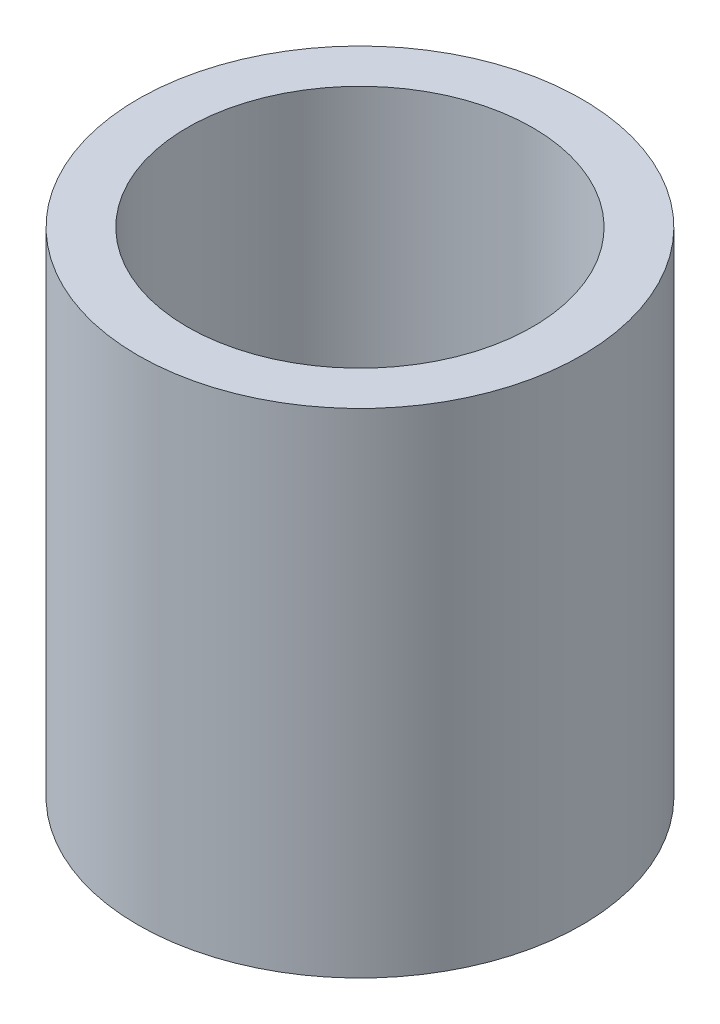
ISO-10303-21;
HEADER;
FILE_DESCRIPTION(('STEP AP214'),'2;1');
FILE_NAME('part.step','',(''),(''),'','','');
FILE_SCHEMA(('AUTOMOTIVE_DESIGN { 1 0 10303 214 1 1 1 1 }'));
ENDSEC;
DATA;
#1=APPLICATION_CONTEXT('core data for automotive mechanical design processes');
#2=APPLICATION_PROTOCOL_DEFINITION('international standard','automotive_design',2000,#1);
#3=PRODUCT_CONTEXT('',#1,'mechanical');
#4=PRODUCT('Part','Part','',(#3));
#5=PRODUCT_RELATED_PRODUCT_CATEGORY('part','',(#4));
#6=PRODUCT_DEFINITION_FORMATION('','',#4);
#7=PRODUCT_DEFINITION_CONTEXT('part definition',#1,'design');
#8=PRODUCT_DEFINITION('design','',#6,#7);
#9=PRODUCT_DEFINITION_SHAPE('','',#8);
#10=(LENGTH_UNIT() NAMED_UNIT(*) SI_UNIT(.MILLI.,.METRE.));
#11=(NAMED_UNIT(*) PLANE_ANGLE_UNIT() SI_UNIT($,.RADIAN.));
#12=(NAMED_UNIT(*) SI_UNIT($,.STERADIAN.) SOLID_ANGLE_UNIT());
#13=UNCERTAINTY_MEASURE_WITH_UNIT(LENGTH_MEASURE(1.E-05),#10,'distance_accuracy_value','');
#14=(GEOMETRIC_REPRESENTATION_CONTEXT(3) GLOBAL_UNCERTAINTY_ASSIGNED_CONTEXT((#13)) GLOBAL_UNIT_ASSIGNED_CONTEXT((#10,
#11,#12)) REPRESENTATION_CONTEXT('',''));
#15=CARTESIAN_POINT('',(0.,0.,0.));
#16=DIRECTION('',(0.,0.,1.));
#17=DIRECTION('',(1.,0.,0.));
#18=AXIS2_PLACEMENT_3D('',#15,#16,#17);
#19=CARTESIAN_POINT('',(0.,10.,0.));
#20=DIRECTION('',(0.,1.,0.));
#21=DIRECTION('',(0.,0.,1.));
#22=AXIS2_PLACEMENT_3D('',#19,#20,#21);
#23=PLANE('',#22);
#24=CARTESIAN_POINT('',(0.,10.,0.));
#25=DIRECTION('',(0.,1.,0.));
#26=DIRECTION('',(0.,0.,1.));
#27=AXIS2_PLACEMENT_3D('',#24,#25,#26);
#28=CIRCLE('',#27,4.5);
#29=CARTESIAN_POINT('',(0.,10.,4.5));
#30=VERTEX_POINT('',#29);
#31=EDGE_CURVE('E10',#30,#30,#28,.T.);
#32=ORIENTED_EDGE('',*,*,#31,.T.);
#33=EDGE_LOOP('',(#32));
#34=FACE_BOUND('',#33,.T.);
#35=CARTESIAN_POINT('',(0.,10.,0.));
#36=DIRECTION('',(0.,1.,0.));
#37=DIRECTION('',(0.,0.,1.));
#38=AXIS2_PLACEMENT_3D('',#35,#36,#37);
#39=CIRCLE('',#38,3.5);
#40=CARTESIAN_POINT('',(0.,10.,3.5));
#41=VERTEX_POINT('',#40);
#42=EDGE_CURVE('E58',#41,#41,#39,.T.);
#43=ORIENTED_EDGE('',*,*,#42,.F.);
#44=EDGE_LOOP('',(#43));
#45=FACE_BOUND('',#44,.T.);
#46=ADVANCED_FACE('F45',(#34,#45),#23,.T.);
#47=CARTESIAN_POINT('',(0.,0.,0.));
#48=DIRECTION('',(0.,1.,0.));
#49=DIRECTION('',(0.,0.,1.));
#50=AXIS2_PLACEMENT_3D('',#47,#48,#49);
#51=PLANE('',#50);
#52=CARTESIAN_POINT('',(0.,0.,0.));
#53=DIRECTION('',(0.,1.,0.));
#54=DIRECTION('',(0.,0.,1.));
#55=AXIS2_PLACEMENT_3D('',#52,#53,#54);
#56=CIRCLE('',#55,4.5);
#57=CARTESIAN_POINT('',(0.,0.,4.5));
#58=VERTEX_POINT('',#57);
#59=EDGE_CURVE('E49',#58,#58,#56,.T.);
#60=ORIENTED_EDGE('',*,*,#59,.F.);
#61=EDGE_LOOP('',(#60));
#62=FACE_BOUND('',#61,.T.);
#63=CARTESIAN_POINT('',(0.,0.,0.));
#64=DIRECTION('',(0.,1.,0.));
#65=DIRECTION('',(0.,0.,1.));
#66=AXIS2_PLACEMENT_3D('',#63,#64,#65);
#67=CIRCLE('',#66,3.5);
#68=CARTESIAN_POINT('',(0.,0.,3.5));
#69=VERTEX_POINT('',#68);
#70=EDGE_CURVE('E60',#69,#69,#67,.T.);
#71=ORIENTED_EDGE('',*,*,#70,.T.);
#72=EDGE_LOOP('',(#71));
#73=FACE_BOUND('',#72,.T.);
#74=ADVANCED_FACE('F72',(#62,#73),#51,.F.);
#75=CARTESIAN_POINT('',(0.,10.,0.));
#76=DIRECTION('',(0.,-1.,0.));
#77=DIRECTION('',(0.,0.,-1.));
#78=AXIS2_PLACEMENT_3D('',#75,#76,#77);
#79=CYLINDRICAL_SURFACE('',#78,4.5);
#80=ORIENTED_EDGE('',*,*,#31,.F.);
#81=EDGE_LOOP('',(#80));
#82=FACE_BOUND('',#81,.T.);
#83=ORIENTED_EDGE('',*,*,#59,.T.);
#84=EDGE_LOOP('',(#83));
#85=FACE_BOUND('',#84,.T.);
#86=ADVANCED_FACE('F47',(#82,#85),#79,.T.);
#87=CARTESIAN_POINT('',(0.,10.,0.));
#88=DIRECTION('',(0.,-1.,0.));
#89=DIRECTION('',(0.,0.,-1.));
#90=AXIS2_PLACEMENT_3D('',#87,#88,#89);
#91=CYLINDRICAL_SURFACE('',#90,3.5);
#92=ORIENTED_EDGE('',*,*,#42,.T.);
#93=EDGE_LOOP('',(#92));
#94=FACE_BOUND('',#93,.T.);
#95=ORIENTED_EDGE('',*,*,#70,.F.);
#96=EDGE_LOOP('',(#95));
#97=FACE_BOUND('',#96,.T.);
#98=ADVANCED_FACE('F68',(#94,#97),#91,.F.);
#99=CLOSED_SHELL('',(#46,#74,#86,#98));
#100=MANIFOLD_SOLID_BREP('B2',#99);
#101=ADVANCED_BREP_SHAPE_REPRESENTATION('',(#18,#100),#14);
#102=SHAPE_DEFINITION_REPRESENTATION(#9,#101);
ENDSEC;
END-ISO-10303-21;
